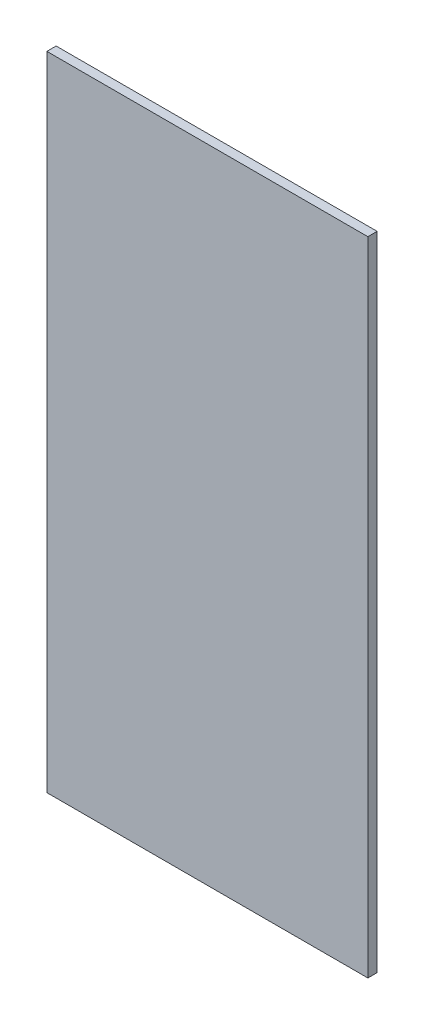
ISO-10303-21;
HEADER;
FILE_DESCRIPTION(('STEP AP214'),'2;1');
FILE_NAME('part.step','',(''),(''),'','','');
FILE_SCHEMA(('AUTOMOTIVE_DESIGN { 1 0 10303 214 1 1 1 1 }'));
ENDSEC;
DATA;
#1=APPLICATION_CONTEXT('core data for automotive mechanical design processes');
#2=APPLICATION_PROTOCOL_DEFINITION('international standard','automotive_design',2000,#1);
#3=PRODUCT_CONTEXT('',#1,'mechanical');
#4=PRODUCT('Part','Part','',(#3));
#5=PRODUCT_RELATED_PRODUCT_CATEGORY('part','',(#4));
#6=PRODUCT_DEFINITION_FORMATION('','',#4);
#7=PRODUCT_DEFINITION_CONTEXT('part definition',#1,'design');
#8=PRODUCT_DEFINITION('design','',#6,#7);
#9=PRODUCT_DEFINITION_SHAPE('','',#8);
#10=(LENGTH_UNIT() NAMED_UNIT(*) SI_UNIT(.MILLI.,.METRE.));
#11=(NAMED_UNIT(*) PLANE_ANGLE_UNIT() SI_UNIT($,.RADIAN.));
#12=(NAMED_UNIT(*) SI_UNIT($,.STERADIAN.) SOLID_ANGLE_UNIT());
#13=UNCERTAINTY_MEASURE_WITH_UNIT(LENGTH_MEASURE(1.E-05),#10,'distance_accuracy_value','');
#14=(GEOMETRIC_REPRESENTATION_CONTEXT(3) GLOBAL_UNCERTAINTY_ASSIGNED_CONTEXT((#13)) GLOBAL_UNIT_ASSIGNED_CONTEXT((#10,
#11,#12)) REPRESENTATION_CONTEXT('',''));
#15=CARTESIAN_POINT('',(0.,0.,0.));
#16=DIRECTION('',(0.,0.,1.));
#17=DIRECTION('',(1.,0.,0.));
#18=AXIS2_PLACEMENT_3D('',#15,#16,#17);
#19=CARTESIAN_POINT('',(-82.5500000000001,165.1,4.7625));
#20=DIRECTION('',(1.,0.,0.));
#21=DIRECTION('',(0.,1.,0.));
#22=AXIS2_PLACEMENT_3D('',#19,#20,#21);
#23=PLANE('',#22);
#24=DIRECTION('',(0.,-1.,0.));
#25=VECTOR('',#24,1.);
#26=CARTESIAN_POINT('',(-82.5500000000001,165.1,0.));
#27=LINE('',#26,#25);
#28=CARTESIAN_POINT('',(-82.5500000000001,165.1,0.));
#29=VERTEX_POINT('',#28);
#30=CARTESIAN_POINT('',(-82.55,-165.1,0.));
#31=VERTEX_POINT('',#30);
#32=EDGE_CURVE('E96',#29,#31,#27,.T.);
#33=ORIENTED_EDGE('',*,*,#32,.T.);
#34=DIRECTION('',(0.,0.,-1.));
#35=VECTOR('',#34,1.);
#36=CARTESIAN_POINT('',(-82.55,-165.1,4.7625));
#37=LINE('',#36,#35);
#38=CARTESIAN_POINT('',(-82.55,-165.1,4.7625));
#39=VERTEX_POINT('',#38);
#40=EDGE_CURVE('E11',#39,#31,#37,.T.);
#41=ORIENTED_EDGE('',*,*,#40,.F.);
#42=DIRECTION('',(0.,-1.,0.));
#43=VECTOR('',#42,1.);
#44=CARTESIAN_POINT('',(-82.5500000000001,165.1,4.7625));
#45=LINE('',#44,#43);
#46=CARTESIAN_POINT('',(-82.5500000000001,165.1,4.7625));
#47=VERTEX_POINT('',#46);
#48=EDGE_CURVE('E84',#47,#39,#45,.T.);
#49=ORIENTED_EDGE('',*,*,#48,.F.);
#50=DIRECTION('',(0.,0.,-1.));
#51=VECTOR('',#50,1.);
#52=CARTESIAN_POINT('',(-82.5500000000001,165.1,4.7625));
#53=LINE('',#52,#51);
#54=EDGE_CURVE('E92',#47,#29,#53,.T.);
#55=ORIENTED_EDGE('',*,*,#54,.T.);
#56=EDGE_LOOP('',(#33,#41,#49,#55));
#57=FACE_BOUND('',#56,.T.);
#58=ADVANCED_FACE('F33',(#57),#23,.F.);
#59=CARTESIAN_POINT('',(-82.55,-165.1,4.7625));
#60=DIRECTION('',(0.,1.,0.));
#61=DIRECTION('',(-1.,0.,0.));
#62=AXIS2_PLACEMENT_3D('',#59,#60,#61);
#63=PLANE('',#62);
#64=DIRECTION('',(1.,0.,0.));
#65=VECTOR('',#64,1.);
#66=CARTESIAN_POINT('',(-82.55,-165.1,0.));
#67=LINE('',#66,#65);
#68=CARTESIAN_POINT('',(82.55,-165.1,0.));
#69=VERTEX_POINT('',#68);
#70=EDGE_CURVE('E88',#31,#69,#67,.T.);
#71=ORIENTED_EDGE('',*,*,#70,.T.);
#72=DIRECTION('',(0.,0.,-1.));
#73=VECTOR('',#72,1.);
#74=CARTESIAN_POINT('',(82.55,-165.1,4.7625));
#75=LINE('',#74,#73);
#76=CARTESIAN_POINT('',(82.55,-165.1,4.7625));
#77=VERTEX_POINT('',#76);
#78=EDGE_CURVE('E41',#77,#69,#75,.T.);
#79=ORIENTED_EDGE('',*,*,#78,.F.);
#80=DIRECTION('',(1.,0.,0.));
#81=VECTOR('',#80,1.);
#82=CARTESIAN_POINT('',(-82.55,-165.1,4.7625));
#83=LINE('',#82,#81);
#84=EDGE_CURVE('E79',#39,#77,#83,.T.);
#85=ORIENTED_EDGE('',*,*,#84,.F.);
#86=ORIENTED_EDGE('',*,*,#40,.T.);
#87=EDGE_LOOP('',(#71,#79,#85,#86));
#88=FACE_BOUND('',#87,.T.);
#89=ADVANCED_FACE('F87',(#88),#63,.F.);
#90=CARTESIAN_POINT('',(82.5499999999999,165.1,4.7625));
#91=DIRECTION('',(-1.,0.,0.));
#92=DIRECTION('',(0.,-1.,0.));
#93=AXIS2_PLACEMENT_3D('',#90,#91,#92);
#94=PLANE('',#93);
#95=DIRECTION('',(0.,1.,0.));
#96=VECTOR('',#95,1.);
#97=CARTESIAN_POINT('',(82.5499999999999,165.1,0.));
#98=LINE('',#97,#96);
#99=CARTESIAN_POINT('',(82.5499999999999,165.1,0.));
#100=VERTEX_POINT('',#99);
#101=EDGE_CURVE('E66',#69,#100,#98,.T.);
#102=ORIENTED_EDGE('',*,*,#101,.T.);
#103=DIRECTION('',(0.,0.,-1.));
#104=VECTOR('',#103,1.);
#105=CARTESIAN_POINT('',(82.5499999999999,165.1,4.7625));
#106=LINE('',#105,#104);
#107=CARTESIAN_POINT('',(82.5499999999999,165.1,4.7625));
#108=VERTEX_POINT('',#107);
#109=EDGE_CURVE('E89',#108,#100,#106,.T.);
#110=ORIENTED_EDGE('',*,*,#109,.F.);
#111=DIRECTION('',(0.,1.,0.));
#112=VECTOR('',#111,1.);
#113=CARTESIAN_POINT('',(82.5499999999999,165.1,4.7625));
#114=LINE('',#113,#112);
#115=EDGE_CURVE('E82',#77,#108,#114,.T.);
#116=ORIENTED_EDGE('',*,*,#115,.F.);
#117=ORIENTED_EDGE('',*,*,#78,.T.);
#118=EDGE_LOOP('',(#102,#110,#116,#117));
#119=FACE_BOUND('',#118,.T.);
#120=ADVANCED_FACE('F90',(#119),#94,.F.);
#121=CARTESIAN_POINT('',(-82.5500000000001,165.1,4.7625));
#122=DIRECTION('',(0.,-1.,0.));
#123=DIRECTION('',(1.,0.,0.));
#124=AXIS2_PLACEMENT_3D('',#121,#122,#123);
#125=PLANE('',#124);
#126=DIRECTION('',(-1.,0.,0.));
#127=VECTOR('',#126,1.);
#128=CARTESIAN_POINT('',(-82.5500000000001,165.1,0.));
#129=LINE('',#128,#127);
#130=EDGE_CURVE('E72',#100,#29,#129,.T.);
#131=ORIENTED_EDGE('',*,*,#130,.T.);
#132=ORIENTED_EDGE('',*,*,#54,.F.);
#133=DIRECTION('',(-1.,0.,0.));
#134=VECTOR('',#133,1.);
#135=CARTESIAN_POINT('',(-82.5500000000001,165.1,4.7625));
#136=LINE('',#135,#134);
#137=EDGE_CURVE('E49',#108,#47,#136,.T.);
#138=ORIENTED_EDGE('',*,*,#137,.F.);
#139=ORIENTED_EDGE('',*,*,#109,.T.);
#140=EDGE_LOOP('',(#131,#132,#138,#139));
#141=FACE_BOUND('',#140,.T.);
#142=ADVANCED_FACE('F103',(#141),#125,.F.);
#143=CARTESIAN_POINT('',(0.,0.,4.7625));
#144=DIRECTION('',(0.,0.,1.));
#145=DIRECTION('',(1.,0.,0.));
#146=AXIS2_PLACEMENT_3D('',#143,#144,#145);
#147=PLANE('',#146);
#148=ORIENTED_EDGE('',*,*,#48,.T.);
#149=ORIENTED_EDGE('',*,*,#84,.T.);
#150=ORIENTED_EDGE('',*,*,#115,.T.);
#151=ORIENTED_EDGE('',*,*,#137,.T.);
#152=EDGE_LOOP('',(#148,#149,#150,#151));
#153=FACE_BOUND('',#152,.T.);
#154=ADVANCED_FACE('F80',(#153),#147,.T.);
#155=CARTESIAN_POINT('',(0.,0.,0.));
#156=DIRECTION('',(0.,0.,1.));
#157=DIRECTION('',(1.,0.,0.));
#158=AXIS2_PLACEMENT_3D('',#155,#156,#157);
#159=PLANE('',#158);
#160=ORIENTED_EDGE('',*,*,#32,.F.);
#161=ORIENTED_EDGE('',*,*,#130,.F.);
#162=ORIENTED_EDGE('',*,*,#101,.F.);
#163=ORIENTED_EDGE('',*,*,#70,.F.);
#164=EDGE_LOOP('',(#160,#161,#162,#163));
#165=FACE_BOUND('',#164,.T.);
#166=ADVANCED_FACE('F106',(#165),#159,.F.);
#167=CLOSED_SHELL('',(#58,#89,#120,#142,#154,#166));
#168=MANIFOLD_SOLID_BREP('B2',#167);
#169=ADVANCED_BREP_SHAPE_REPRESENTATION('',(#18,#168),#14);
#170=SHAPE_DEFINITION_REPRESENTATION(#9,#169);
ENDSEC;
END-ISO-10303-21;
